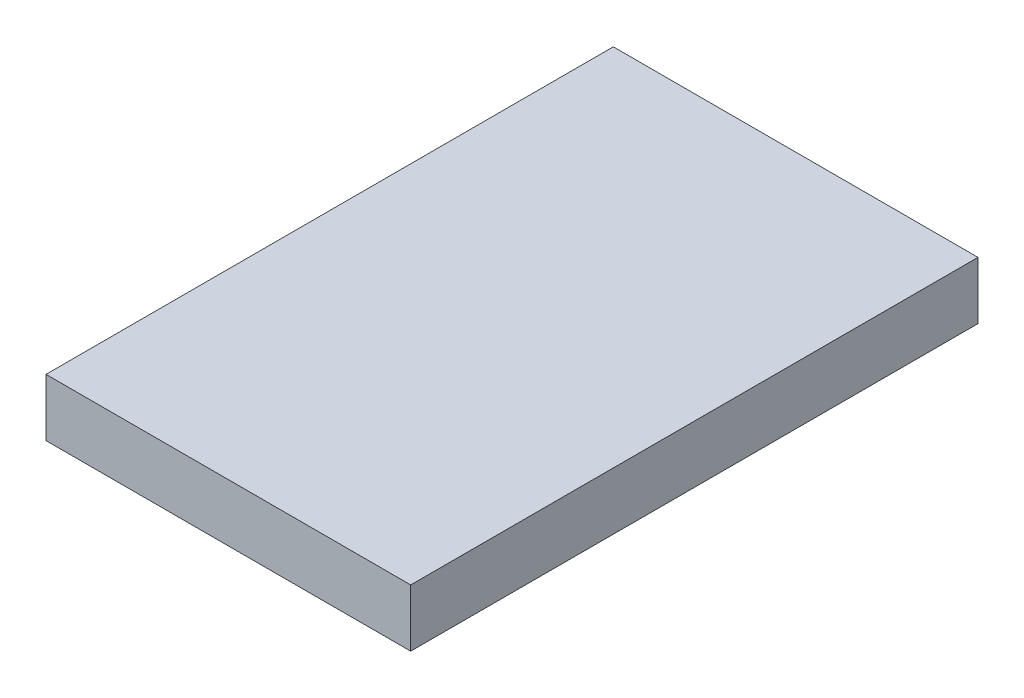
ISO-10303-21;
HEADER;
FILE_DESCRIPTION(('STEP AP214'),'2;1');
FILE_NAME('part.step','',(''),(''),'','','');
FILE_SCHEMA(('AUTOMOTIVE_DESIGN { 1 0 10303 214 1 1 1 1 }'));
ENDSEC;
DATA;
#1=APPLICATION_CONTEXT('core data for automotive mechanical design processes');
#2=APPLICATION_PROTOCOL_DEFINITION('international standard','automotive_design',2000,#1);
#3=PRODUCT_CONTEXT('',#1,'mechanical');
#4=PRODUCT('Part','Part','',(#3));
#5=PRODUCT_RELATED_PRODUCT_CATEGORY('part','',(#4));
#6=PRODUCT_DEFINITION_FORMATION('','',#4);
#7=PRODUCT_DEFINITION_CONTEXT('part definition',#1,'design');
#8=PRODUCT_DEFINITION('design','',#6,#7);
#9=PRODUCT_DEFINITION_SHAPE('','',#8);
#10=(LENGTH_UNIT() NAMED_UNIT(*) SI_UNIT(.MILLI.,.METRE.));
#11=(NAMED_UNIT(*) PLANE_ANGLE_UNIT() SI_UNIT($,.RADIAN.));
#12=(NAMED_UNIT(*) SI_UNIT($,.STERADIAN.) SOLID_ANGLE_UNIT());
#13=UNCERTAINTY_MEASURE_WITH_UNIT(LENGTH_MEASURE(1.E-05),#10,'distance_accuracy_value','');
#14=(GEOMETRIC_REPRESENTATION_CONTEXT(3) GLOBAL_UNCERTAINTY_ASSIGNED_CONTEXT((#13)) GLOBAL_UNIT_ASSIGNED_CONTEXT((#10,
#11,#12)) REPRESENTATION_CONTEXT('',''));
#15=CARTESIAN_POINT('',(0.,0.,0.));
#16=DIRECTION('',(0.,0.,1.));
#17=DIRECTION('',(1.,0.,0.));
#18=AXIS2_PLACEMENT_3D('',#15,#16,#17);
#19=CARTESIAN_POINT('',(0.,8.5,0.));
#20=DIRECTION('',(-1.,0.,0.));
#21=DIRECTION('',(0.,0.,1.));
#22=AXIS2_PLACEMENT_3D('',#19,#20,#21);
#23=PLANE('',#22);
#24=DIRECTION('',(0.,0.,-1.));
#25=VECTOR('',#24,1.);
#26=CARTESIAN_POINT('',(0.,0.,0.));
#27=LINE('',#26,#25);
#28=CARTESIAN_POINT('',(0.,0.,0.));
#29=VERTEX_POINT('',#28);
#30=CARTESIAN_POINT('',(0.,0.,-84.));
#31=VERTEX_POINT('',#30);
#32=EDGE_CURVE('E96',#29,#31,#27,.T.);
#33=ORIENTED_EDGE('',*,*,#32,.T.);
#34=DIRECTION('',(0.,-1.,0.));
#35=VECTOR('',#34,1.);
#36=CARTESIAN_POINT('',(0.,8.5,-84.));
#37=LINE('',#36,#35);
#38=CARTESIAN_POINT('',(0.,8.5,-84.));
#39=VERTEX_POINT('',#38);
#40=EDGE_CURVE('E11',#39,#31,#37,.T.);
#41=ORIENTED_EDGE('',*,*,#40,.F.);
#42=DIRECTION('',(0.,0.,-1.));
#43=VECTOR('',#42,1.);
#44=CARTESIAN_POINT('',(0.,8.5,0.));
#45=LINE('',#44,#43);
#46=CARTESIAN_POINT('',(0.,8.5,0.));
#47=VERTEX_POINT('',#46);
#48=EDGE_CURVE('E84',#47,#39,#45,.T.);
#49=ORIENTED_EDGE('',*,*,#48,.F.);
#50=DIRECTION('',(0.,-1.,0.));
#51=VECTOR('',#50,1.);
#52=CARTESIAN_POINT('',(0.,8.5,0.));
#53=LINE('',#52,#51);
#54=EDGE_CURVE('E92',#47,#29,#53,.T.);
#55=ORIENTED_EDGE('',*,*,#54,.T.);
#56=EDGE_LOOP('',(#33,#41,#49,#55));
#57=FACE_BOUND('',#56,.T.);
#58=ADVANCED_FACE('F33',(#57),#23,.F.);
#59=CARTESIAN_POINT('',(0.,8.5,-84.));
#60=DIRECTION('',(0.,0.,1.));
#61=DIRECTION('',(1.,0.,0.));
#62=AXIS2_PLACEMENT_3D('',#59,#60,#61);
#63=PLANE('',#62);
#64=DIRECTION('',(-1.,0.,0.));
#65=VECTOR('',#64,1.);
#66=CARTESIAN_POINT('',(0.,0.,-84.));
#67=LINE('',#66,#65);
#68=CARTESIAN_POINT('',(-54.,0.,-84.));
#69=VERTEX_POINT('',#68);
#70=EDGE_CURVE('E88',#31,#69,#67,.T.);
#71=ORIENTED_EDGE('',*,*,#70,.T.);
#72=DIRECTION('',(0.,-1.,0.));
#73=VECTOR('',#72,1.);
#74=CARTESIAN_POINT('',(-54.,8.5,-84.));
#75=LINE('',#74,#73);
#76=CARTESIAN_POINT('',(-54.,8.5,-84.));
#77=VERTEX_POINT('',#76);
#78=EDGE_CURVE('E41',#77,#69,#75,.T.);
#79=ORIENTED_EDGE('',*,*,#78,.F.);
#80=DIRECTION('',(-1.,0.,0.));
#81=VECTOR('',#80,1.);
#82=CARTESIAN_POINT('',(0.,8.5,-84.));
#83=LINE('',#82,#81);
#84=EDGE_CURVE('E79',#39,#77,#83,.T.);
#85=ORIENTED_EDGE('',*,*,#84,.F.);
#86=ORIENTED_EDGE('',*,*,#40,.T.);
#87=EDGE_LOOP('',(#71,#79,#85,#86));
#88=FACE_BOUND('',#87,.T.);
#89=ADVANCED_FACE('F87',(#88),#63,.F.);
#90=CARTESIAN_POINT('',(-54.,8.5,0.));
#91=DIRECTION('',(1.,0.,0.));
#92=DIRECTION('',(0.,0.,-1.));
#93=AXIS2_PLACEMENT_3D('',#90,#91,#92);
#94=PLANE('',#93);
#95=DIRECTION('',(0.,0.,1.));
#96=VECTOR('',#95,1.);
#97=CARTESIAN_POINT('',(-54.,0.,0.));
#98=LINE('',#97,#96);
#99=CARTESIAN_POINT('',(-54.,0.,0.));
#100=VERTEX_POINT('',#99);
#101=EDGE_CURVE('E66',#69,#100,#98,.T.);
#102=ORIENTED_EDGE('',*,*,#101,.T.);
#103=DIRECTION('',(0.,-1.,0.));
#104=VECTOR('',#103,1.);
#105=CARTESIAN_POINT('',(-54.,8.5,0.));
#106=LINE('',#105,#104);
#107=CARTESIAN_POINT('',(-54.,8.5,0.));
#108=VERTEX_POINT('',#107);
#109=EDGE_CURVE('E89',#108,#100,#106,.T.);
#110=ORIENTED_EDGE('',*,*,#109,.F.);
#111=DIRECTION('',(0.,0.,1.));
#112=VECTOR('',#111,1.);
#113=CARTESIAN_POINT('',(-54.,8.5,0.));
#114=LINE('',#113,#112);
#115=EDGE_CURVE('E82',#77,#108,#114,.T.);
#116=ORIENTED_EDGE('',*,*,#115,.F.);
#117=ORIENTED_EDGE('',*,*,#78,.T.);
#118=EDGE_LOOP('',(#102,#110,#116,#117));
#119=FACE_BOUND('',#118,.T.);
#120=ADVANCED_FACE('F90',(#119),#94,.F.);
#121=CARTESIAN_POINT('',(0.,8.5,0.));
#122=DIRECTION('',(0.,0.,-1.));
#123=DIRECTION('',(-1.,0.,0.));
#124=AXIS2_PLACEMENT_3D('',#121,#122,#123);
#125=PLANE('',#124);
#126=DIRECTION('',(1.,0.,0.));
#127=VECTOR('',#126,1.);
#128=CARTESIAN_POINT('',(0.,0.,0.));
#129=LINE('',#128,#127);
#130=EDGE_CURVE('E72',#100,#29,#129,.T.);
#131=ORIENTED_EDGE('',*,*,#130,.T.);
#132=ORIENTED_EDGE('',*,*,#54,.F.);
#133=DIRECTION('',(1.,0.,0.));
#134=VECTOR('',#133,1.);
#135=CARTESIAN_POINT('',(0.,8.5,0.));
#136=LINE('',#135,#134);
#137=EDGE_CURVE('E49',#108,#47,#136,.T.);
#138=ORIENTED_EDGE('',*,*,#137,.F.);
#139=ORIENTED_EDGE('',*,*,#109,.T.);
#140=EDGE_LOOP('',(#131,#132,#138,#139));
#141=FACE_BOUND('',#140,.T.);
#142=ADVANCED_FACE('F103',(#141),#125,.F.);
#143=CARTESIAN_POINT('',(0.,8.5,0.));
#144=DIRECTION('',(0.,1.,0.));
#145=DIRECTION('',(0.,0.,1.));
#146=AXIS2_PLACEMENT_3D('',#143,#144,#145);
#147=PLANE('',#146);
#148=ORIENTED_EDGE('',*,*,#48,.T.);
#149=ORIENTED_EDGE('',*,*,#84,.T.);
#150=ORIENTED_EDGE('',*,*,#115,.T.);
#151=ORIENTED_EDGE('',*,*,#137,.T.);
#152=EDGE_LOOP('',(#148,#149,#150,#151));
#153=FACE_BOUND('',#152,.T.);
#154=ADVANCED_FACE('F80',(#153),#147,.T.);
#155=CARTESIAN_POINT('',(0.,0.,0.));
#156=DIRECTION('',(0.,1.,0.));
#157=DIRECTION('',(0.,0.,1.));
#158=AXIS2_PLACEMENT_3D('',#155,#156,#157);
#159=PLANE('',#158);
#160=ORIENTED_EDGE('',*,*,#32,.F.);
#161=ORIENTED_EDGE('',*,*,#130,.F.);
#162=ORIENTED_EDGE('',*,*,#101,.F.);
#163=ORIENTED_EDGE('',*,*,#70,.F.);
#164=EDGE_LOOP('',(#160,#161,#162,#163));
#165=FACE_BOUND('',#164,.T.);
#166=ADVANCED_FACE('F106',(#165),#159,.F.);
#167=CLOSED_SHELL('',(#58,#89,#120,#142,#154,#166));
#168=MANIFOLD_SOLID_BREP('B2',#167);
#169=ADVANCED_BREP_SHAPE_REPRESENTATION('',(#18,#168),#14);
#170=SHAPE_DEFINITION_REPRESENTATION(#9,#169);
ENDSEC;
END-ISO-10303-21;
